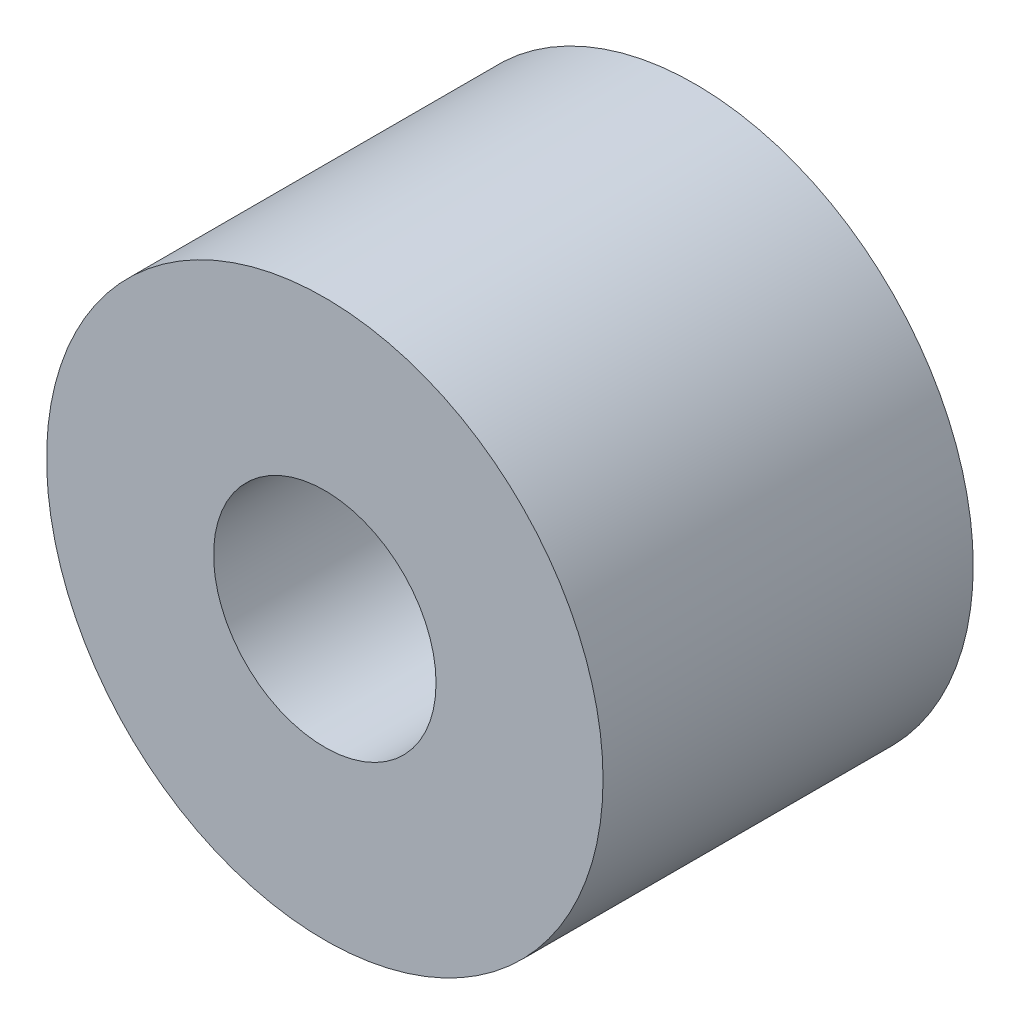
ISO-10303-21;
HEADER;
FILE_DESCRIPTION(('STEP AP214'),'2;1');
FILE_NAME('part.step','',(''),(''),'','','');
FILE_SCHEMA(('AUTOMOTIVE_DESIGN { 1 0 10303 214 1 1 1 1 }'));
ENDSEC;
DATA;
#1=APPLICATION_CONTEXT('core data for automotive mechanical design processes');
#2=APPLICATION_PROTOCOL_DEFINITION('international standard','automotive_design',2000,#1);
#3=PRODUCT_CONTEXT('',#1,'mechanical');
#4=PRODUCT('Part','Part','',(#3));
#5=PRODUCT_RELATED_PRODUCT_CATEGORY('part','',(#4));
#6=PRODUCT_DEFINITION_FORMATION('','',#4);
#7=PRODUCT_DEFINITION_CONTEXT('part definition',#1,'design');
#8=PRODUCT_DEFINITION('design','',#6,#7);
#9=PRODUCT_DEFINITION_SHAPE('','',#8);
#10=(LENGTH_UNIT() NAMED_UNIT(*) SI_UNIT(.MILLI.,.METRE.));
#11=(NAMED_UNIT(*) PLANE_ANGLE_UNIT() SI_UNIT($,.RADIAN.));
#12=(NAMED_UNIT(*) SI_UNIT($,.STERADIAN.) SOLID_ANGLE_UNIT());
#13=UNCERTAINTY_MEASURE_WITH_UNIT(LENGTH_MEASURE(1.E-05),#10,'distance_accuracy_value','');
#14=(GEOMETRIC_REPRESENTATION_CONTEXT(3) GLOBAL_UNCERTAINTY_ASSIGNED_CONTEXT((#13)) GLOBAL_UNIT_ASSIGNED_CONTEXT((#10,
#11,#12)) REPRESENTATION_CONTEXT('',''));
#15=CARTESIAN_POINT('',(0.,0.,0.));
#16=DIRECTION('',(0.,0.,1.));
#17=DIRECTION('',(1.,0.,0.));
#18=AXIS2_PLACEMENT_3D('',#15,#16,#17);
#19=CARTESIAN_POINT('',(0.,0.,1268.));
#20=DIRECTION('',(0.,0.,1.));
#21=DIRECTION('',(1.,0.,0.));
#22=AXIS2_PLACEMENT_3D('',#19,#20,#21);
#23=PLANE('',#22);
#24=CARTESIAN_POINT('',(0.,0.,1268.));
#25=DIRECTION('',(0.,0.,1.));
#26=DIRECTION('',(1.,0.,0.));
#27=AXIS2_PLACEMENT_3D('',#24,#25,#26);
#28=CIRCLE('',#27,953.);
#29=CARTESIAN_POINT('',(953.,0.,1268.));
#30=VERTEX_POINT('',#29);
#31=EDGE_CURVE('E10',#30,#30,#28,.T.);
#32=ORIENTED_EDGE('',*,*,#31,.T.);
#33=EDGE_LOOP('',(#32));
#34=FACE_BOUND('',#33,.T.);
#35=CARTESIAN_POINT('',(0.,0.,1268.));
#36=DIRECTION('',(0.,0.,1.));
#37=DIRECTION('',(1.,0.,0.));
#38=AXIS2_PLACEMENT_3D('',#35,#36,#37);
#39=CIRCLE('',#38,381.);
#40=CARTESIAN_POINT('',(381.,0.,1268.));
#41=VERTEX_POINT('',#40);
#42=EDGE_CURVE('E45',#41,#41,#39,.T.);
#43=ORIENTED_EDGE('',*,*,#42,.F.);
#44=EDGE_LOOP('',(#43));
#45=FACE_BOUND('',#44,.T.);
#46=ADVANCED_FACE('F34',(#34,#45),#23,.T.);
#47=CARTESIAN_POINT('',(0.,0.,0.));
#48=DIRECTION('',(0.,0.,1.));
#49=DIRECTION('',(1.,0.,0.));
#50=AXIS2_PLACEMENT_3D('',#47,#48,#49);
#51=PLANE('',#50);
#52=CARTESIAN_POINT('',(0.,0.,0.));
#53=DIRECTION('',(0.,0.,1.));
#54=DIRECTION('',(1.,0.,0.));
#55=AXIS2_PLACEMENT_3D('',#52,#53,#54);
#56=CIRCLE('',#55,953.);
#57=CARTESIAN_POINT('',(953.,0.,0.));
#58=VERTEX_POINT('',#57);
#59=EDGE_CURVE('E38',#58,#58,#56,.T.);
#60=ORIENTED_EDGE('',*,*,#59,.F.);
#61=EDGE_LOOP('',(#60));
#62=FACE_BOUND('',#61,.T.);
#63=CARTESIAN_POINT('',(0.,0.,0.));
#64=DIRECTION('',(0.,0.,1.));
#65=DIRECTION('',(1.,0.,0.));
#66=AXIS2_PLACEMENT_3D('',#63,#64,#65);
#67=CIRCLE('',#66,381.);
#68=CARTESIAN_POINT('',(381.,0.,0.));
#69=VERTEX_POINT('',#68);
#70=EDGE_CURVE('E47',#69,#69,#67,.T.);
#71=ORIENTED_EDGE('',*,*,#70,.T.);
#72=EDGE_LOOP('',(#71));
#73=FACE_BOUND('',#72,.T.);
#74=ADVANCED_FACE('F57',(#62,#73),#51,.F.);
#75=CARTESIAN_POINT('',(0.,0.,1268.));
#76=DIRECTION('',(0.,0.,-1.));
#77=DIRECTION('',(-1.,0.,0.));
#78=AXIS2_PLACEMENT_3D('',#75,#76,#77);
#79=CYLINDRICAL_SURFACE('',#78,953.);
#80=ORIENTED_EDGE('',*,*,#31,.F.);
#81=EDGE_LOOP('',(#80));
#82=FACE_BOUND('',#81,.T.);
#83=ORIENTED_EDGE('',*,*,#59,.T.);
#84=EDGE_LOOP('',(#83));
#85=FACE_BOUND('',#84,.T.);
#86=ADVANCED_FACE('F36',(#82,#85),#79,.T.);
#87=CARTESIAN_POINT('',(0.,0.,1268.));
#88=DIRECTION('',(0.,0.,-1.));
#89=DIRECTION('',(-1.,0.,0.));
#90=AXIS2_PLACEMENT_3D('',#87,#88,#89);
#91=CYLINDRICAL_SURFACE('',#90,381.);
#92=ORIENTED_EDGE('',*,*,#42,.T.);
#93=EDGE_LOOP('',(#92));
#94=FACE_BOUND('',#93,.T.);
#95=ORIENTED_EDGE('',*,*,#70,.F.);
#96=EDGE_LOOP('',(#95));
#97=FACE_BOUND('',#96,.T.);
#98=ADVANCED_FACE('F53',(#94,#97),#91,.F.);
#99=CLOSED_SHELL('',(#46,#74,#86,#98));
#100=MANIFOLD_SOLID_BREP('B2',#99);
#101=ADVANCED_BREP_SHAPE_REPRESENTATION('',(#18,#100),#14);
#102=SHAPE_DEFINITION_REPRESENTATION(#9,#101);
ENDSEC;
END-ISO-10303-21;
